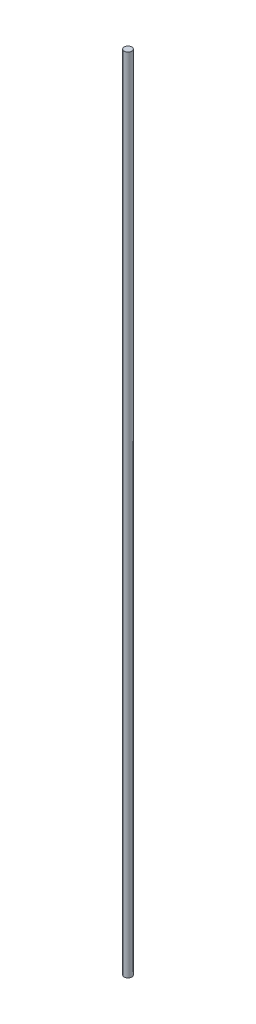
ISO-10303-21;
HEADER;
FILE_DESCRIPTION(('STEP AP214'),'2;1');
FILE_NAME('part.step','',(''),(''),'','','');
FILE_SCHEMA(('AUTOMOTIVE_DESIGN { 1 0 10303 214 1 1 1 1 }'));
ENDSEC;
DATA;
#1=APPLICATION_CONTEXT('core data for automotive mechanical design processes');
#2=APPLICATION_PROTOCOL_DEFINITION('international standard','automotive_design',2000,#1);
#3=PRODUCT_CONTEXT('',#1,'mechanical');
#4=PRODUCT('Part','Part','',(#3));
#5=PRODUCT_RELATED_PRODUCT_CATEGORY('part','',(#4));
#6=PRODUCT_DEFINITION_FORMATION('','',#4);
#7=PRODUCT_DEFINITION_CONTEXT('part definition',#1,'design');
#8=PRODUCT_DEFINITION('design','',#6,#7);
#9=PRODUCT_DEFINITION_SHAPE('','',#8);
#10=(LENGTH_UNIT() NAMED_UNIT(*) SI_UNIT(.MILLI.,.METRE.));
#11=(NAMED_UNIT(*) PLANE_ANGLE_UNIT() SI_UNIT($,.RADIAN.));
#12=(NAMED_UNIT(*) SI_UNIT($,.STERADIAN.) SOLID_ANGLE_UNIT());
#13=UNCERTAINTY_MEASURE_WITH_UNIT(LENGTH_MEASURE(1.E-05),#10,'distance_accuracy_value','');
#14=(GEOMETRIC_REPRESENTATION_CONTEXT(3) GLOBAL_UNCERTAINTY_ASSIGNED_CONTEXT((#13)) GLOBAL_UNIT_ASSIGNED_CONTEXT((#10,
#11,#12)) REPRESENTATION_CONTEXT('',''));
#15=CARTESIAN_POINT('',(0.,0.,0.));
#16=DIRECTION('',(0.,0.,1.));
#17=DIRECTION('',(1.,0.,0.));
#18=AXIS2_PLACEMENT_3D('',#15,#16,#17);
#19=CARTESIAN_POINT('',(0.,213.8,0.));
#20=DIRECTION('',(0.,-1.,0.));
#21=DIRECTION('',(0.,0.,-1.));
#22=AXIS2_PLACEMENT_3D('',#19,#20,#21);
#23=CYLINDRICAL_SURFACE('',#22,1.);
#24=CARTESIAN_POINT('',(0.,213.8,0.));
#25=DIRECTION('',(0.,1.,0.));
#26=DIRECTION('',(0.,0.,1.));
#27=AXIS2_PLACEMENT_3D('',#24,#25,#26);
#28=CIRCLE('',#27,1.);
#29=CARTESIAN_POINT('',(0.,213.8,1.));
#30=VERTEX_POINT('',#29);
#31=EDGE_CURVE('E10',#30,#30,#28,.T.);
#32=ORIENTED_EDGE('',*,*,#31,.F.);
#33=EDGE_LOOP('',(#32));
#34=FACE_BOUND('',#33,.T.);
#35=CARTESIAN_POINT('',(0.,0.,0.));
#36=DIRECTION('',(0.,1.,0.));
#37=DIRECTION('',(0.,0.,1.));
#38=AXIS2_PLACEMENT_3D('',#35,#36,#37);
#39=CIRCLE('',#38,1.);
#40=CARTESIAN_POINT('',(0.,0.,1.));
#41=VERTEX_POINT('',#40);
#42=EDGE_CURVE('E34',#41,#41,#39,.T.);
#43=ORIENTED_EDGE('',*,*,#42,.T.);
#44=EDGE_LOOP('',(#43));
#45=FACE_BOUND('',#44,.T.);
#46=ADVANCED_FACE('F31',(#34,#45),#23,.T.);
#47=CARTESIAN_POINT('',(0.,213.8,0.));
#48=DIRECTION('',(0.,1.,0.));
#49=DIRECTION('',(0.,0.,1.));
#50=AXIS2_PLACEMENT_3D('',#47,#48,#49);
#51=PLANE('',#50);
#52=ORIENTED_EDGE('',*,*,#31,.T.);
#53=EDGE_LOOP('',(#52));
#54=FACE_BOUND('',#53,.T.);
#55=ADVANCED_FACE('F46',(#54),#51,.T.);
#56=CARTESIAN_POINT('',(0.,0.,0.));
#57=DIRECTION('',(0.,1.,0.));
#58=DIRECTION('',(0.,0.,1.));
#59=AXIS2_PLACEMENT_3D('',#56,#57,#58);
#60=PLANE('',#59);
#61=ORIENTED_EDGE('',*,*,#42,.F.);
#62=EDGE_LOOP('',(#61));
#63=FACE_BOUND('',#62,.T.);
#64=ADVANCED_FACE('F44',(#63),#60,.F.);
#65=CLOSED_SHELL('',(#46,#55,#64));
#66=MANIFOLD_SOLID_BREP('B2',#65);
#67=ADVANCED_BREP_SHAPE_REPRESENTATION('',(#18,#66),#14);
#68=SHAPE_DEFINITION_REPRESENTATION(#9,#67);
ENDSEC;
END-ISO-10303-21;
